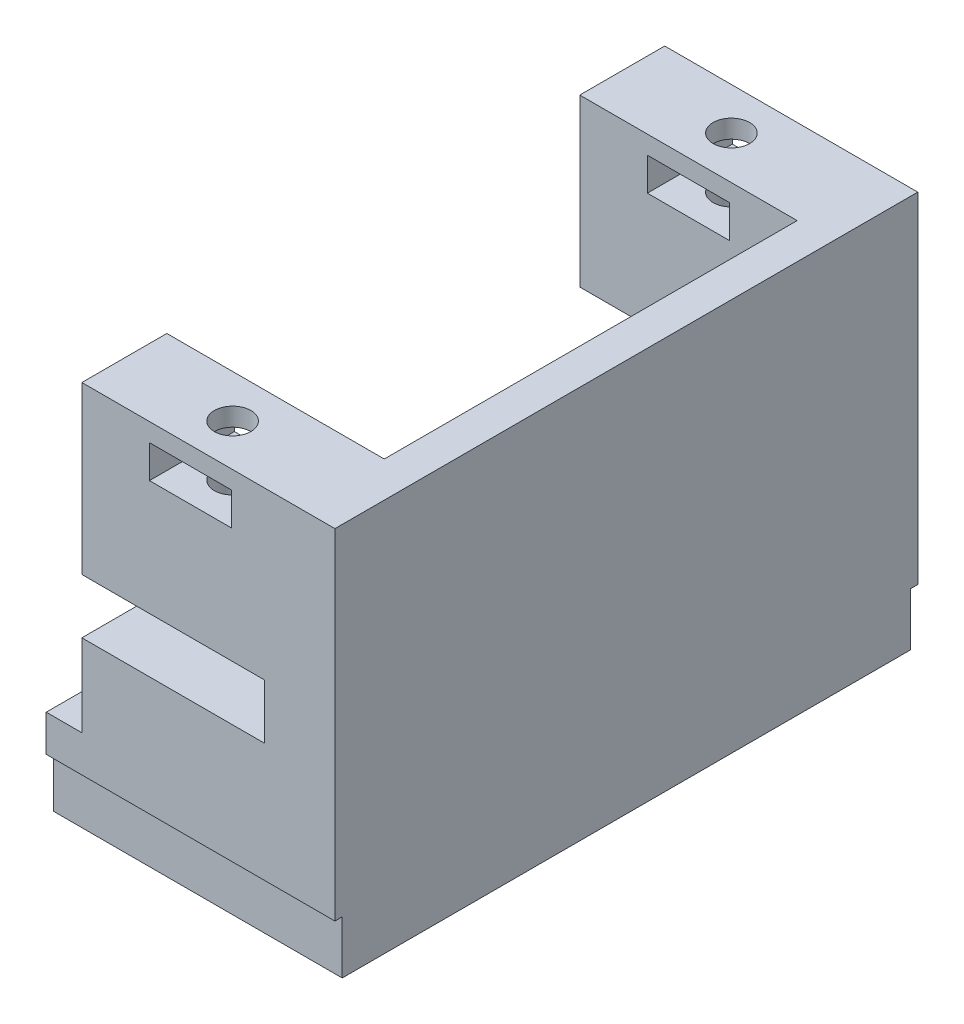
ISO-10303-21;
HEADER;
FILE_DESCRIPTION(('STEP AP214'),'2;1');
FILE_NAME('part.step','',(''),(''),'','','');
FILE_SCHEMA(('AUTOMOTIVE_DESIGN { 1 0 10303 214 1 1 1 1 }'));
ENDSEC;
DATA;
#1=APPLICATION_CONTEXT('core data for automotive mechanical design processes');
#2=APPLICATION_PROTOCOL_DEFINITION('international standard','automotive_design',2000,#1);
#3=PRODUCT_CONTEXT('',#1,'mechanical');
#4=PRODUCT('Part','Part','',(#3));
#5=PRODUCT_RELATED_PRODUCT_CATEGORY('part','',(#4));
#6=PRODUCT_DEFINITION_FORMATION('','',#4);
#7=PRODUCT_DEFINITION_CONTEXT('part definition',#1,'design');
#8=PRODUCT_DEFINITION('design','',#6,#7);
#9=PRODUCT_DEFINITION_SHAPE('','',#8);
#10=(LENGTH_UNIT() NAMED_UNIT(*) SI_UNIT(.MILLI.,.METRE.));
#11=(NAMED_UNIT(*) PLANE_ANGLE_UNIT() SI_UNIT($,.RADIAN.));
#12=(NAMED_UNIT(*) SI_UNIT($,.STERADIAN.) SOLID_ANGLE_UNIT());
#13=UNCERTAINTY_MEASURE_WITH_UNIT(LENGTH_MEASURE(1.E-05),#10,'distance_accuracy_value','');
#14=(GEOMETRIC_REPRESENTATION_CONTEXT(3) GLOBAL_UNCERTAINTY_ASSIGNED_CONTEXT((#13)) GLOBAL_UNIT_ASSIGNED_CONTEXT((#10,
#11,#12)) REPRESENTATION_CONTEXT('',''));
#15=CARTESIAN_POINT('',(0.,0.,0.));
#16=DIRECTION('',(0.,0.,1.));
#17=DIRECTION('',(1.,0.,0.));
#18=AXIS2_PLACEMENT_3D('',#15,#16,#17);
#19=CARTESIAN_POINT('',(-7.9,2.,-15.95));
#20=DIRECTION('',(0.,0.,1.));
#21=DIRECTION('',(1.,0.,0.));
#22=AXIS2_PLACEMENT_3D('',#19,#20,#21);
#23=PLANE('',#22);
#24=DIRECTION('',(0.,-1.,0.));
#25=VECTOR('',#24,1.);
#26=CARTESIAN_POINT('',(2.25000000000001,0.,-15.95));
#27=LINE('',#26,#25);
#28=CARTESIAN_POINT('',(2.25,17.6,-15.95));
#29=VERTEX_POINT('',#28);
#30=CARTESIAN_POINT('',(2.25,15.8,-15.95));
#31=VERTEX_POINT('',#30);
#32=EDGE_CURVE('E405',#29,#31,#27,.T.);
#33=ORIENTED_EDGE('',*,*,#32,.F.);
#34=DIRECTION('',(1.,0.,0.));
#35=VECTOR('',#34,1.);
#36=CARTESIAN_POINT('',(0.,17.6,-15.95));
#37=LINE('',#36,#35);
#38=CARTESIAN_POINT('',(-2.25,17.6,-15.95));
#39=VERTEX_POINT('',#38);
#40=EDGE_CURVE('E407',#39,#29,#37,.T.);
#41=ORIENTED_EDGE('',*,*,#40,.F.);
#42=DIRECTION('',(0.,-1.,0.));
#43=VECTOR('',#42,1.);
#44=CARTESIAN_POINT('',(-2.25,0.,-15.95));
#45=LINE('',#44,#43);
#46=CARTESIAN_POINT('',(-2.25,15.8,-15.95));
#47=VERTEX_POINT('',#46);
#48=EDGE_CURVE('E410',#39,#47,#45,.T.);
#49=ORIENTED_EDGE('',*,*,#48,.T.);
#50=DIRECTION('',(1.,0.,0.));
#51=VECTOR('',#50,1.);
#52=CARTESIAN_POINT('',(0.,15.8,-15.95));
#53=LINE('',#52,#51);
#54=EDGE_CURVE('E413',#47,#31,#53,.T.);
#55=ORIENTED_EDGE('',*,*,#54,.T.);
#56=EDGE_LOOP('',(#33,#41,#49,#55));
#57=FACE_BOUND('',#56,.T.);
#58=DIRECTION('',(-1.,0.,0.));
#59=VECTOR('',#58,1.);
#60=CARTESIAN_POINT('',(4.05,6.5,-15.95));
#61=LINE('',#60,#59);
#62=CARTESIAN_POINT('',(4.05,6.5,-15.95));
#63=VERTEX_POINT('',#62);
#64=CARTESIAN_POINT('',(-5.95,6.5,-15.95));
#65=VERTEX_POINT('',#64);
#66=EDGE_CURVE('E281',#63,#65,#61,.T.);
#67=ORIENTED_EDGE('',*,*,#66,.F.);
#68=DIRECTION('',(0.,1.,0.));
#69=VECTOR('',#68,1.);
#70=CARTESIAN_POINT('',(4.05,9.5,-15.95));
#71=LINE('',#70,#69);
#72=CARTESIAN_POINT('',(4.05,9.5,-15.95));
#73=VERTEX_POINT('',#72);
#74=EDGE_CURVE('E265',#63,#73,#71,.T.);
#75=ORIENTED_EDGE('',*,*,#74,.T.);
#76=DIRECTION('',(-1.,0.,0.));
#77=VECTOR('',#76,1.);
#78=CARTESIAN_POINT('',(4.05,9.5,-15.95));
#79=LINE('',#78,#77);
#80=CARTESIAN_POINT('',(-5.95,9.5,-15.95));
#81=VERTEX_POINT('',#80);
#82=EDGE_CURVE('E261',#73,#81,#79,.T.);
#83=ORIENTED_EDGE('',*,*,#82,.T.);
#84=DIRECTION('',(0.,1.,0.));
#85=VECTOR('',#84,1.);
#86=CARTESIAN_POINT('',(-5.95,-29.9595447401868,-15.95));
#87=LINE('',#86,#85);
#88=CARTESIAN_POINT('',(-5.95,18.6,-15.95));
#89=VERTEX_POINT('',#88);
#90=EDGE_CURVE('E398',#81,#89,#87,.T.);
#91=ORIENTED_EDGE('',*,*,#90,.T.);
#92=DIRECTION('',(-1.,0.,0.));
#93=VECTOR('',#92,1.);
#94=CARTESIAN_POINT('',(0.,18.6,-15.95));
#95=LINE('',#94,#93);
#96=CARTESIAN_POINT('',(7.9,18.6,-15.95));
#97=VERTEX_POINT('',#96);
#98=EDGE_CURVE('E478',#97,#89,#95,.T.);
#99=ORIENTED_EDGE('',*,*,#98,.F.);
#100=DIRECTION('',(0.,-1.,0.));
#101=VECTOR('',#100,1.);
#102=CARTESIAN_POINT('',(7.9,2.,-15.95));
#103=LINE('',#102,#101);
#104=CARTESIAN_POINT('',(7.9,0.,-15.95));
#105=VERTEX_POINT('',#104);
#106=EDGE_CURVE('E521',#97,#105,#103,.T.);
#107=ORIENTED_EDGE('',*,*,#106,.T.);
#108=DIRECTION('',(-1.,0.,0.));
#109=VECTOR('',#108,1.);
#110=CARTESIAN_POINT('',(-7.9,0.,-15.95));
#111=LINE('',#110,#109);
#112=CARTESIAN_POINT('',(-7.9,0.,-15.95));
#113=VERTEX_POINT('',#112);
#114=EDGE_CURVE('E510',#105,#113,#111,.T.);
#115=ORIENTED_EDGE('',*,*,#114,.T.);
#116=DIRECTION('',(0.,-1.,0.));
#117=VECTOR('',#116,1.);
#118=CARTESIAN_POINT('',(-7.9,2.,-15.95));
#119=LINE('',#118,#117);
#120=CARTESIAN_POINT('',(-7.9,2.,-15.95));
#121=VERTEX_POINT('',#120);
#122=EDGE_CURVE('E528',#121,#113,#119,.T.);
#123=ORIENTED_EDGE('',*,*,#122,.F.);
#124=DIRECTION('',(1.,0.,0.));
#125=VECTOR('',#124,1.);
#126=CARTESIAN_POINT('',(-7.9,2.,-15.95));
#127=LINE('',#126,#125);
#128=CARTESIAN_POINT('',(-5.95,2.,-15.95));
#129=VERTEX_POINT('',#128);
#130=EDGE_CURVE('E384',#121,#129,#127,.T.);
#131=ORIENTED_EDGE('',*,*,#130,.T.);
#132=EDGE_CURVE('E395',#129,#65,#87,.T.);
#133=ORIENTED_EDGE('',*,*,#132,.T.);
#134=EDGE_LOOP('',(#67,#75,#83,#91,#99,#107,#115,#123,#131,#133));
#135=FACE_BOUND('',#134,.T.);
#136=ADVANCED_FACE('F35',(#57,#135),#23,.F.);
#137=CARTESIAN_POINT('',(0.,18.6,-11.3));
#138=DIRECTION('',(0.,0.,-1.));
#139=DIRECTION('',(-1.,0.,0.));
#140=AXIS2_PLACEMENT_3D('',#137,#138,#139);
#141=PLANE('',#140);
#142=DIRECTION('',(0.,1.,0.));
#143=VECTOR('',#142,1.);
#144=CARTESIAN_POINT('',(2.25,18.6,-11.3));
#145=LINE('',#144,#143);
#146=CARTESIAN_POINT('',(2.25,15.8,-11.3));
#147=VERTEX_POINT('',#146);
#148=CARTESIAN_POINT('',(2.25,17.6,-11.3));
#149=VERTEX_POINT('',#148);
#150=EDGE_CURVE('E462',#147,#149,#145,.T.);
#151=ORIENTED_EDGE('',*,*,#150,.F.);
#152=DIRECTION('',(-1.,0.,0.));
#153=VECTOR('',#152,1.);
#154=CARTESIAN_POINT('',(0.,15.8,-11.3));
#155=LINE('',#154,#153);
#156=CARTESIAN_POINT('',(-2.25,15.8,-11.3));
#157=VERTEX_POINT('',#156);
#158=EDGE_CURVE('E456',#147,#157,#155,.T.);
#159=ORIENTED_EDGE('',*,*,#158,.T.);
#160=DIRECTION('',(0.,1.,0.));
#161=VECTOR('',#160,1.);
#162=CARTESIAN_POINT('',(-2.25,18.6,-11.3));
#163=LINE('',#162,#161);
#164=CARTESIAN_POINT('',(-2.25,17.6,-11.3));
#165=VERTEX_POINT('',#164);
#166=EDGE_CURVE('E459',#157,#165,#163,.T.);
#167=ORIENTED_EDGE('',*,*,#166,.T.);
#168=DIRECTION('',(-1.,0.,0.));
#169=VECTOR('',#168,1.);
#170=CARTESIAN_POINT('',(0.,17.6,-11.3));
#171=LINE('',#170,#169);
#172=EDGE_CURVE('E448',#149,#165,#171,.T.);
#173=ORIENTED_EDGE('',*,*,#172,.F.);
#174=EDGE_LOOP('',(#151,#159,#167,#173));
#175=FACE_BOUND('',#174,.T.);
#176=DIRECTION('',(-1.,0.,0.));
#177=VECTOR('',#176,1.);
#178=CARTESIAN_POINT('',(4.05,6.5,-11.3));
#179=LINE('',#178,#177);
#180=CARTESIAN_POINT('',(4.05,6.5,-11.3));
#181=VERTEX_POINT('',#180);
#182=CARTESIAN_POINT('',(-5.95,6.5,-11.3));
#183=VERTEX_POINT('',#182);
#184=EDGE_CURVE('E290',#181,#183,#179,.T.);
#185=ORIENTED_EDGE('',*,*,#184,.T.);
#186=DIRECTION('',(0.,-1.,0.));
#187=VECTOR('',#186,1.);
#188=CARTESIAN_POINT('',(-5.95,18.6,-11.3));
#189=LINE('',#188,#187);
#190=CARTESIAN_POINT('',(-5.95,2.,-11.3));
#191=VERTEX_POINT('',#190);
#192=EDGE_CURVE('E489',#183,#191,#189,.T.);
#193=ORIENTED_EDGE('',*,*,#192,.T.);
#194=DIRECTION('',(1.,0.,0.));
#195=VECTOR('',#194,1.);
#196=CARTESIAN_POINT('',(0.,2.,-11.3));
#197=LINE('',#196,#195);
#198=CARTESIAN_POINT('',(5.95,2.,-11.3));
#199=VERTEX_POINT('',#198);
#200=EDGE_CURVE('E471',#191,#199,#197,.T.);
#201=ORIENTED_EDGE('',*,*,#200,.T.);
#202=DIRECTION('',(0.,-1.,0.));
#203=VECTOR('',#202,1.);
#204=CARTESIAN_POINT('',(5.95,18.6,-11.3));
#205=LINE('',#204,#203);
#206=CARTESIAN_POINT('',(5.95,18.6,-11.3));
#207=VERTEX_POINT('',#206);
#208=EDGE_CURVE('E504',#207,#199,#205,.T.);
#209=ORIENTED_EDGE('',*,*,#208,.F.);
#210=DIRECTION('',(1.,0.,0.));
#211=VECTOR('',#210,1.);
#212=CARTESIAN_POINT('',(0.,18.6,-11.3));
#213=LINE('',#212,#211);
#214=CARTESIAN_POINT('',(-5.95,18.6,-11.3));
#215=VERTEX_POINT('',#214);
#216=EDGE_CURVE('E481',#215,#207,#213,.T.);
#217=ORIENTED_EDGE('',*,*,#216,.F.);
#218=CARTESIAN_POINT('',(-5.95,9.50000000000001,-11.3));
#219=VERTEX_POINT('',#218);
#220=EDGE_CURVE('E279',#215,#219,#189,.T.);
#221=ORIENTED_EDGE('',*,*,#220,.T.);
#222=DIRECTION('',(-1.,0.,0.));
#223=VECTOR('',#222,1.);
#224=CARTESIAN_POINT('',(4.05,9.5,-11.3));
#225=LINE('',#224,#223);
#226=CARTESIAN_POINT('',(4.05,9.5,-11.3));
#227=VERTEX_POINT('',#226);
#228=EDGE_CURVE('E53',#227,#219,#225,.T.);
#229=ORIENTED_EDGE('',*,*,#228,.F.);
#230=DIRECTION('',(0.,-1.,0.));
#231=VECTOR('',#230,1.);
#232=CARTESIAN_POINT('',(4.05,9.5,-11.3));
#233=LINE('',#232,#231);
#234=EDGE_CURVE('E266',#227,#181,#233,.T.);
#235=ORIENTED_EDGE('',*,*,#234,.T.);
#236=EDGE_LOOP('',(#185,#193,#201,#209,#217,#221,#229,#235));
#237=FACE_BOUND('',#236,.T.);
#238=ADVANCED_FACE('F277',(#175,#237),#141,.F.);
#239=CARTESIAN_POINT('',(0.,8.6,-13.65));
#240=DIRECTION('',(0.,1.,0.));
#241=DIRECTION('',(0.,0.,1.));
#242=AXIS2_PLACEMENT_3D('',#239,#240,#241);
#243=CYLINDRICAL_SURFACE('',#242,1.);
#244=CARTESIAN_POINT('',(0.,15.8,-13.65));
#245=DIRECTION('',(0.,-1.,0.));
#246=DIRECTION('',(0.,0.,-1.));
#247=AXIS2_PLACEMENT_3D('',#244,#245,#246);
#248=CIRCLE('',#247,1.);
#249=CARTESIAN_POINT('',(0.,15.8,-14.65));
#250=VERTEX_POINT('',#249);
#251=EDGE_CURVE('E451',#250,#250,#248,.F.);
#252=ORIENTED_EDGE('',*,*,#251,.T.);
#253=EDGE_LOOP('',(#252));
#254=FACE_BOUND('',#253,.T.);
#255=CARTESIAN_POINT('',(0.,9.5,-13.65));
#256=DIRECTION('',(0.,-1.,0.));
#257=DIRECTION('',(0.,0.,-1.));
#258=AXIS2_PLACEMENT_3D('',#255,#256,#257);
#259=CIRCLE('',#258,1.);
#260=CARTESIAN_POINT('',(0.,9.5,-14.65));
#261=VERTEX_POINT('',#260);
#262=EDGE_CURVE('E286',#261,#261,#259,.F.);
#263=ORIENTED_EDGE('',*,*,#262,.F.);
#264=EDGE_LOOP('',(#263));
#265=FACE_BOUND('',#264,.T.);
#266=ADVANCED_FACE('F591',(#254,#265),#243,.F.);
#267=CARTESIAN_POINT('',(-5.95,-29.9595447401868,-15.95));
#268=DIRECTION('',(1.,0.,0.));
#269=DIRECTION('',(0.,0.,-1.));
#270=AXIS2_PLACEMENT_3D('',#267,#268,#269);
#271=PLANE('',#270);
#272=DIRECTION('',(0.,0.,-1.));
#273=VECTOR('',#272,1.);
#274=CARTESIAN_POINT('',(-5.95,6.5,-11.3));
#275=LINE('',#274,#273);
#276=EDGE_CURVE('E274',#183,#65,#275,.T.);
#277=ORIENTED_EDGE('',*,*,#276,.T.);
#278=ORIENTED_EDGE('',*,*,#132,.F.);
#279=DIRECTION('',(0.,0.,1.));
#280=VECTOR('',#279,1.);
#281=CARTESIAN_POINT('',(-5.95,2.,-15.95));
#282=LINE('',#281,#280);
#283=EDGE_CURVE('E381',#129,#191,#282,.T.);
#284=ORIENTED_EDGE('',*,*,#283,.T.);
#285=ORIENTED_EDGE('',*,*,#192,.F.);
#286=EDGE_LOOP('',(#277,#278,#284,#285));
#287=FACE_BOUND('',#286,.T.);
#288=ADVANCED_FACE('F627',(#287),#271,.F.);
#289=DIRECTION('',(0.,0.,1.));
#290=VECTOR('',#289,1.);
#291=CARTESIAN_POINT('',(-5.95,9.5,-11.3));
#292=LINE('',#291,#290);
#293=EDGE_CURVE('E706',#81,#219,#292,.T.);
#294=ORIENTED_EDGE('',*,*,#293,.T.);
#295=ORIENTED_EDGE('',*,*,#220,.F.);
#296=DIRECTION('',(0.,0.,-1.));
#297=VECTOR('',#296,1.);
#298=CARTESIAN_POINT('',(-5.95,18.6,-15.95));
#299=LINE('',#298,#297);
#300=EDGE_CURVE('E380',#215,#89,#299,.T.);
#301=ORIENTED_EDGE('',*,*,#300,.T.);
#302=ORIENTED_EDGE('',*,*,#90,.F.);
#303=EDGE_LOOP('',(#294,#295,#301,#302));
#304=FACE_BOUND('',#303,.T.);
#305=ADVANCED_FACE('F715',(#304),#271,.F.);
#306=CARTESIAN_POINT('',(0.,0.,0.));
#307=DIRECTION('',(0.,1.,0.));
#308=DIRECTION('',(0.,0.,1.));
#309=AXIS2_PLACEMENT_3D('',#306,#307,#308);
#310=PLANE('',#309);
#311=DIRECTION('',(1.,0.,0.));
#312=VECTOR('',#311,1.);
#313=CARTESIAN_POINT('',(0.,0.,-15.55));
#314=LINE('',#313,#312);
#315=CARTESIAN_POINT('',(-7.9,0.,-15.55));
#316=VERTEX_POINT('',#315);
#317=CARTESIAN_POINT('',(7.9,0.,-15.55));
#318=VERTEX_POINT('',#317);
#319=EDGE_CURVE('E321',#316,#318,#314,.T.);
#320=ORIENTED_EDGE('',*,*,#319,.F.);
#321=DIRECTION('',(0.,0.,1.));
#322=VECTOR('',#321,1.);
#323=CARTESIAN_POINT('',(-7.9,0.,-15.95));
#324=LINE('',#323,#322);
#325=EDGE_CURVE('E537',#113,#316,#324,.T.);
#326=ORIENTED_EDGE('',*,*,#325,.F.);
#327=ORIENTED_EDGE('',*,*,#114,.F.);
#328=DIRECTION('',(0.,0.,-1.));
#329=VECTOR('',#328,1.);
#330=CARTESIAN_POINT('',(7.9,0.,-15.95));
#331=LINE('',#330,#329);
#332=EDGE_CURVE('E507',#318,#105,#331,.T.);
#333=ORIENTED_EDGE('',*,*,#332,.F.);
#334=EDGE_LOOP('',(#320,#326,#327,#333));
#335=FACE_BOUND('',#334,.T.);
#336=ADVANCED_FACE('F559',(#335),#310,.F.);
#337=CARTESIAN_POINT('',(-7.9,0.,15.55));
#338=VERTEX_POINT('',#337);
#339=CARTESIAN_POINT('',(-7.9,0.,15.95));
#340=VERTEX_POINT('',#339);
#341=EDGE_CURVE('E542',#338,#340,#324,.T.);
#342=ORIENTED_EDGE('',*,*,#341,.F.);
#343=DIRECTION('',(1.,0.,0.));
#344=VECTOR('',#343,1.);
#345=CARTESIAN_POINT('',(0.,0.,15.55));
#346=LINE('',#345,#344);
#347=CARTESIAN_POINT('',(7.9,0.,15.55));
#348=VERTEX_POINT('',#347);
#349=EDGE_CURVE('E295',#338,#348,#346,.T.);
#350=ORIENTED_EDGE('',*,*,#349,.T.);
#351=CARTESIAN_POINT('',(7.9,0.,15.95));
#352=VERTEX_POINT('',#351);
#353=EDGE_CURVE('E516',#352,#348,#331,.T.);
#354=ORIENTED_EDGE('',*,*,#353,.F.);
#355=DIRECTION('',(1.,0.,0.));
#356=VECTOR('',#355,1.);
#357=CARTESIAN_POINT('',(-7.9,0.,15.95));
#358=LINE('',#357,#356);
#359=EDGE_CURVE('E536',#340,#352,#358,.T.);
#360=ORIENTED_EDGE('',*,*,#359,.F.);
#361=EDGE_LOOP('',(#342,#350,#354,#360));
#362=FACE_BOUND('',#361,.T.);
#363=ADVANCED_FACE('F608',(#362),#310,.F.);
#364=DIRECTION('',(0.,-1.,0.));
#365=VECTOR('',#364,1.);
#366=CARTESIAN_POINT('',(-5.95,18.6,11.3));
#367=LINE('',#366,#365);
#368=CARTESIAN_POINT('',(-5.95,18.6,11.3));
#369=VERTEX_POINT('',#368);
#370=CARTESIAN_POINT('',(-5.95,9.5,11.3));
#371=VERTEX_POINT('',#370);
#372=EDGE_CURVE('E498',#369,#371,#367,.T.);
#373=ORIENTED_EDGE('',*,*,#372,.T.);
#374=DIRECTION('',(0.,0.,-1.));
#375=VECTOR('',#374,1.);
#376=CARTESIAN_POINT('',(-5.95,9.5,11.3));
#377=LINE('',#376,#375);
#378=CARTESIAN_POINT('',(-5.95,9.5,15.95));
#379=VERTEX_POINT('',#378);
#380=EDGE_CURVE('E356',#379,#371,#377,.T.);
#381=ORIENTED_EDGE('',*,*,#380,.F.);
#382=DIRECTION('',(0.,1.,0.));
#383=VECTOR('',#382,1.);
#384=CARTESIAN_POINT('',(-5.95,-29.9595447401868,15.95));
#385=LINE('',#384,#383);
#386=CARTESIAN_POINT('',(-5.95,18.6,15.95));
#387=VERTEX_POINT('',#386);
#388=EDGE_CURVE('E394',#379,#387,#385,.T.);
#389=ORIENTED_EDGE('',*,*,#388,.T.);
#390=EDGE_CURVE('E392',#387,#369,#299,.T.);
#391=ORIENTED_EDGE('',*,*,#390,.T.);
#392=EDGE_LOOP('',(#373,#381,#389,#391));
#393=FACE_BOUND('',#392,.T.);
#394=ADVANCED_FACE('F599',(#393),#271,.F.);
#395=CARTESIAN_POINT('',(-7.9,2.,-15.95));
#396=DIRECTION('',(1.,0.,0.));
#397=DIRECTION('',(0.,0.,-1.));
#398=AXIS2_PLACEMENT_3D('',#395,#396,#397);
#399=PLANE('',#398);
#400=DIRECTION('',(0.,0.,-1.));
#401=VECTOR('',#400,1.);
#402=CARTESIAN_POINT('',(-7.9,2.,-15.95));
#403=LINE('',#402,#401);
#404=CARTESIAN_POINT('',(-7.9,2.,15.95));
#405=VERTEX_POINT('',#404);
#406=EDGE_CURVE('E388',#405,#121,#403,.T.);
#407=ORIENTED_EDGE('',*,*,#406,.T.);
#408=ORIENTED_EDGE('',*,*,#122,.T.);
#409=ORIENTED_EDGE('',*,*,#325,.T.);
#410=DIRECTION('',(0.,1.,0.));
#411=VECTOR('',#410,1.);
#412=CARTESIAN_POINT('',(-7.9,-2.9,-15.55));
#413=LINE('',#412,#411);
#414=CARTESIAN_POINT('',(-7.9,-2.9,-15.55));
#415=VERTEX_POINT('',#414);
#416=EDGE_CURVE('E330',#415,#316,#413,.T.);
#417=ORIENTED_EDGE('',*,*,#416,.F.);
#418=DIRECTION('',(0.,0.,-1.));
#419=VECTOR('',#418,1.);
#420=CARTESIAN_POINT('',(-7.9,-2.9,0.));
#421=LINE('',#420,#419);
#422=CARTESIAN_POINT('',(-7.9,-2.9,-12.55));
#423=VERTEX_POINT('',#422);
#424=EDGE_CURVE('E302',#423,#415,#421,.T.);
#425=ORIENTED_EDGE('',*,*,#424,.F.);
#426=DIRECTION('',(0.,1.,0.));
#427=VECTOR('',#426,1.);
#428=CARTESIAN_POINT('',(-7.9,-2.9,-12.55));
#429=LINE('',#428,#427);
#430=CARTESIAN_POINT('',(-7.9,0.,-12.55));
#431=VERTEX_POINT('',#430);
#432=EDGE_CURVE('E336',#423,#431,#429,.T.);
#433=ORIENTED_EDGE('',*,*,#432,.T.);
#434=CARTESIAN_POINT('',(-7.9,0.,12.55));
#435=VERTEX_POINT('',#434);
#436=EDGE_CURVE('E546',#431,#435,#324,.T.);
#437=ORIENTED_EDGE('',*,*,#436,.T.);
#438=DIRECTION('',(0.,1.,0.));
#439=VECTOR('',#438,1.);
#440=CARTESIAN_POINT('',(-7.9,-2.9,12.55));
#441=LINE('',#440,#439);
#442=CARTESIAN_POINT('',(-7.9,-2.9,12.55));
#443=VERTEX_POINT('',#442);
#444=EDGE_CURVE('E349',#443,#435,#441,.T.);
#445=ORIENTED_EDGE('',*,*,#444,.F.);
#446=DIRECTION('',(0.,0.,-1.));
#447=VECTOR('',#446,1.);
#448=CARTESIAN_POINT('',(-7.9,-2.9,0.));
#449=LINE('',#448,#447);
#450=CARTESIAN_POINT('',(-7.9,-2.9,15.55));
#451=VERTEX_POINT('',#450);
#452=EDGE_CURVE('E291',#451,#443,#449,.T.);
#453=ORIENTED_EDGE('',*,*,#452,.F.);
#454=DIRECTION('',(0.,1.,0.));
#455=VECTOR('',#454,1.);
#456=CARTESIAN_POINT('',(-7.9,-2.9,15.55));
#457=LINE('',#456,#455);
#458=EDGE_CURVE('E311',#451,#338,#457,.T.);
#459=ORIENTED_EDGE('',*,*,#458,.T.);
#460=ORIENTED_EDGE('',*,*,#341,.T.);
#461=DIRECTION('',(0.,-1.,0.));
#462=VECTOR('',#461,1.);
#463=CARTESIAN_POINT('',(-7.9,2.,15.95));
#464=LINE('',#463,#462);
#465=EDGE_CURVE('E530',#405,#340,#464,.T.);
#466=ORIENTED_EDGE('',*,*,#465,.F.);
#467=EDGE_LOOP('',(#407,#408,#409,#417,#425,#433,#437,#445,#453,#459,#460,#466));
#468=FACE_BOUND('',#467,.T.);
#469=ADVANCED_FACE('F561',(#468),#399,.F.);
#470=CARTESIAN_POINT('',(-7.9,2.,15.95));
#471=DIRECTION('',(0.,0.,-1.));
#472=DIRECTION('',(-1.,0.,0.));
#473=AXIS2_PLACEMENT_3D('',#470,#471,#472);
#474=PLANE('',#473);
#475=ORIENTED_EDGE('',*,*,#388,.F.);
#476=DIRECTION('',(-1.,0.,0.));
#477=VECTOR('',#476,1.);
#478=CARTESIAN_POINT('',(4.05,9.5,15.95));
#479=LINE('',#478,#477);
#480=CARTESIAN_POINT('',(4.05,9.5,15.95));
#481=VERTEX_POINT('',#480);
#482=EDGE_CURVE('E372',#481,#379,#479,.T.);
#483=ORIENTED_EDGE('',*,*,#482,.F.);
#484=DIRECTION('',(0.,1.,0.));
#485=VECTOR('',#484,1.);
#486=CARTESIAN_POINT('',(4.05,9.5,15.95));
#487=LINE('',#486,#485);
#488=CARTESIAN_POINT('',(4.05,6.5,15.95));
#489=VERTEX_POINT('',#488);
#490=EDGE_CURVE('E359',#489,#481,#487,.T.);
#491=ORIENTED_EDGE('',*,*,#490,.F.);
#492=DIRECTION('',(-1.,0.,0.));
#493=VECTOR('',#492,1.);
#494=CARTESIAN_POINT('',(4.05,6.5,15.95));
#495=LINE('',#494,#493);
#496=CARTESIAN_POINT('',(-5.95,6.5,15.95));
#497=VERTEX_POINT('',#496);
#498=EDGE_CURVE('E374',#489,#497,#495,.T.);
#499=ORIENTED_EDGE('',*,*,#498,.T.);
#500=CARTESIAN_POINT('',(-5.95,1.99999999999999,15.95));
#501=VERTEX_POINT('',#500);
#502=EDGE_CURVE('E399',#501,#497,#385,.T.);
#503=ORIENTED_EDGE('',*,*,#502,.F.);
#504=DIRECTION('',(-1.,0.,0.));
#505=VECTOR('',#504,1.);
#506=CARTESIAN_POINT('',(-7.9,2.,15.95));
#507=LINE('',#506,#505);
#508=EDGE_CURVE('E391',#501,#405,#507,.T.);
#509=ORIENTED_EDGE('',*,*,#508,.T.);
#510=ORIENTED_EDGE('',*,*,#465,.T.);
#511=ORIENTED_EDGE('',*,*,#359,.T.);
#512=DIRECTION('',(0.,-1.,0.));
#513=VECTOR('',#512,1.);
#514=CARTESIAN_POINT('',(7.9,2.,15.95));
#515=LINE('',#514,#513);
#516=CARTESIAN_POINT('',(7.9,18.6,15.95));
#517=VERTEX_POINT('',#516);
#518=EDGE_CURVE('E533',#517,#352,#515,.T.);
#519=ORIENTED_EDGE('',*,*,#518,.F.);
#520=DIRECTION('',(1.,0.,0.));
#521=VECTOR('',#520,1.);
#522=CARTESIAN_POINT('',(0.,18.6,15.95));
#523=LINE('',#522,#521);
#524=EDGE_CURVE('E472',#387,#517,#523,.T.);
#525=ORIENTED_EDGE('',*,*,#524,.F.);
#526=EDGE_LOOP('',(#475,#483,#491,#499,#503,#509,#510,#511,#519,#525));
#527=FACE_BOUND('',#526,.T.);
#528=DIRECTION('',(0.,-1.,0.));
#529=VECTOR('',#528,1.);
#530=CARTESIAN_POINT('',(2.25000000000001,0.,15.95));
#531=LINE('',#530,#529);
#532=CARTESIAN_POINT('',(2.25,17.6,15.95));
#533=VERTEX_POINT('',#532);
#534=CARTESIAN_POINT('',(2.25,15.8,15.95));
#535=VERTEX_POINT('',#534);
#536=EDGE_CURVE('E404',#533,#535,#531,.T.);
#537=ORIENTED_EDGE('',*,*,#536,.T.);
#538=DIRECTION('',(1.,0.,0.));
#539=VECTOR('',#538,1.);
#540=CARTESIAN_POINT('',(0.,15.8,15.95));
#541=LINE('',#540,#539);
#542=CARTESIAN_POINT('',(-2.25,15.8,15.95));
#543=VERTEX_POINT('',#542);
#544=EDGE_CURVE('E408',#543,#535,#541,.T.);
#545=ORIENTED_EDGE('',*,*,#544,.F.);
#546=DIRECTION('',(0.,-1.,0.));
#547=VECTOR('',#546,1.);
#548=CARTESIAN_POINT('',(-2.25,0.,15.95));
#549=LINE('',#548,#547);
#550=CARTESIAN_POINT('',(-2.25,17.6,15.95));
#551=VERTEX_POINT('',#550);
#552=EDGE_CURVE('E422',#551,#543,#549,.T.);
#553=ORIENTED_EDGE('',*,*,#552,.F.);
#554=DIRECTION('',(1.,0.,0.));
#555=VECTOR('',#554,1.);
#556=CARTESIAN_POINT('',(0.,17.6,15.95));
#557=LINE('',#556,#555);
#558=EDGE_CURVE('E419',#551,#533,#557,.T.);
#559=ORIENTED_EDGE('',*,*,#558,.T.);
#560=EDGE_LOOP('',(#537,#545,#553,#559));
#561=FACE_BOUND('',#560,.T.);
#562=ADVANCED_FACE('F598',(#527,#561),#474,.F.);
#563=CARTESIAN_POINT('',(0.,18.6,11.3));
#564=DIRECTION('',(0.,0.,-1.));
#565=DIRECTION('',(-1.,0.,0.));
#566=AXIS2_PLACEMENT_3D('',#563,#564,#565);
#567=PLANE('',#566);
#568=DIRECTION('',(-1.,0.,0.));
#569=VECTOR('',#568,1.);
#570=CARTESIAN_POINT('',(4.05,9.5,11.3));
#571=LINE('',#570,#569);
#572=CARTESIAN_POINT('',(4.05,9.5,11.3));
#573=VERTEX_POINT('',#572);
#574=EDGE_CURVE('E368',#573,#371,#571,.T.);
#575=ORIENTED_EDGE('',*,*,#574,.T.);
#576=ORIENTED_EDGE('',*,*,#372,.F.);
#577=DIRECTION('',(1.,0.,0.));
#578=VECTOR('',#577,1.);
#579=CARTESIAN_POINT('',(0.,18.6,11.3));
#580=LINE('',#579,#578);
#581=CARTESIAN_POINT('',(5.95,18.6,11.3));
#582=VERTEX_POINT('',#581);
#583=EDGE_CURVE('E486',#369,#582,#580,.T.);
#584=ORIENTED_EDGE('',*,*,#583,.T.);
#585=DIRECTION('',(0.,-1.,0.));
#586=VECTOR('',#585,1.);
#587=CARTESIAN_POINT('',(5.95,18.6,11.3));
#588=LINE('',#587,#586);
#589=CARTESIAN_POINT('',(5.95,2.,11.3));
#590=VERTEX_POINT('',#589);
#591=EDGE_CURVE('E501',#582,#590,#588,.T.);
#592=ORIENTED_EDGE('',*,*,#591,.T.);
#593=DIRECTION('',(1.,0.,0.));
#594=VECTOR('',#593,1.);
#595=CARTESIAN_POINT('',(0.,2.,11.3));
#596=LINE('',#595,#594);
#597=CARTESIAN_POINT('',(-5.95,2.,11.3));
#598=VERTEX_POINT('',#597);
#599=EDGE_CURVE('E475',#598,#590,#596,.T.);
#600=ORIENTED_EDGE('',*,*,#599,.F.);
#601=CARTESIAN_POINT('',(-5.95,6.5,11.3));
#602=VERTEX_POINT('',#601);
#603=EDGE_CURVE('E497',#602,#598,#367,.T.);
#604=ORIENTED_EDGE('',*,*,#603,.F.);
#605=DIRECTION('',(-1.,0.,0.));
#606=VECTOR('',#605,1.);
#607=CARTESIAN_POINT('',(4.05,6.5,11.3));
#608=LINE('',#607,#606);
#609=CARTESIAN_POINT('',(4.05,6.5,11.3));
#610=VERTEX_POINT('',#609);
#611=EDGE_CURVE('E364',#610,#602,#608,.T.);
#612=ORIENTED_EDGE('',*,*,#611,.F.);
#613=DIRECTION('',(0.,-1.,0.));
#614=VECTOR('',#613,1.);
#615=CARTESIAN_POINT('',(4.05,9.5,11.3));
#616=LINE('',#615,#614);
#617=EDGE_CURVE('E352',#573,#610,#616,.T.);
#618=ORIENTED_EDGE('',*,*,#617,.F.);
#619=EDGE_LOOP('',(#575,#576,#584,#592,#600,#604,#612,#618));
#620=FACE_BOUND('',#619,.T.);
#621=DIRECTION('',(-1.,0.,0.));
#622=VECTOR('',#621,1.);
#623=CARTESIAN_POINT('',(0.,15.8,11.3));
#624=LINE('',#623,#622);
#625=CARTESIAN_POINT('',(2.25,15.8,11.3));
#626=VERTEX_POINT('',#625);
#627=CARTESIAN_POINT('',(-2.25,15.8,11.3));
#628=VERTEX_POINT('',#627);
#629=EDGE_CURVE('E454',#626,#628,#624,.T.);
#630=ORIENTED_EDGE('',*,*,#629,.F.);
#631=DIRECTION('',(0.,1.,0.));
#632=VECTOR('',#631,1.);
#633=CARTESIAN_POINT('',(2.25,18.6,11.3));
#634=LINE('',#633,#632);
#635=CARTESIAN_POINT('',(2.25,17.6,11.3));
#636=VERTEX_POINT('',#635);
#637=EDGE_CURVE('E11',#626,#636,#634,.T.);
#638=ORIENTED_EDGE('',*,*,#637,.T.);
#639=DIRECTION('',(-1.,0.,0.));
#640=VECTOR('',#639,1.);
#641=CARTESIAN_POINT('',(0.,17.6,11.3));
#642=LINE('',#641,#640);
#643=CARTESIAN_POINT('',(-2.25,17.6,11.3));
#644=VERTEX_POINT('',#643);
#645=EDGE_CURVE('E445',#636,#644,#642,.T.);
#646=ORIENTED_EDGE('',*,*,#645,.T.);
#647=DIRECTION('',(0.,1.,0.));
#648=VECTOR('',#647,1.);
#649=CARTESIAN_POINT('',(-2.25,18.6,11.3));
#650=LINE('',#649,#648);
#651=EDGE_CURVE('E45',#628,#644,#650,.T.);
#652=ORIENTED_EDGE('',*,*,#651,.F.);
#653=EDGE_LOOP('',(#630,#638,#646,#652));
#654=FACE_BOUND('',#653,.T.);
#655=ADVANCED_FACE('F602',(#620,#654),#567,.T.);
#656=CARTESIAN_POINT('',(0.,18.6,-13.65));
#657=DIRECTION('',(0.,1.,0.));
#658=DIRECTION('',(0.,0.,1.));
#659=AXIS2_PLACEMENT_3D('',#656,#657,#658);
#660=CIRCLE('',#659,1.);
#661=CARTESIAN_POINT('',(0.,18.6,-12.65));
#662=VERTEX_POINT('',#661);
#663=EDGE_CURVE('E468',#662,#662,#660,.T.);
#664=ORIENTED_EDGE('',*,*,#663,.T.);
#665=EDGE_LOOP('',(#664));
#666=FACE_BOUND('',#665,.T.);
#667=CARTESIAN_POINT('',(0.,17.6,-13.65));
#668=DIRECTION('',(0.,-1.,0.));
#669=DIRECTION('',(0.,0.,-1.));
#670=AXIS2_PLACEMENT_3D('',#667,#668,#669);
#671=CIRCLE('',#670,1.);
#672=CARTESIAN_POINT('',(0.,17.6,-14.65));
#673=VERTEX_POINT('',#672);
#674=EDGE_CURVE('E442',#673,#673,#671,.F.);
#675=ORIENTED_EDGE('',*,*,#674,.F.);
#676=EDGE_LOOP('',(#675));
#677=FACE_BOUND('',#676,.T.);
#678=ADVANCED_FACE('F620',(#666,#677),#243,.F.);
#679=CARTESIAN_POINT('',(0.,8.6,13.65));
#680=DIRECTION('',(0.,1.,0.));
#681=DIRECTION('',(0.,0.,1.));
#682=AXIS2_PLACEMENT_3D('',#679,#680,#681);
#683=CYLINDRICAL_SURFACE('',#682,1.);
#684=CARTESIAN_POINT('',(0.,18.6,13.65));
#685=DIRECTION('',(0.,1.,0.));
#686=DIRECTION('',(0.,0.,-1.));
#687=AXIS2_PLACEMENT_3D('',#684,#685,#686);
#688=CIRCLE('',#687,1.);
#689=CARTESIAN_POINT('',(0.,18.6,12.65));
#690=VERTEX_POINT('',#689);
#691=EDGE_CURVE('E465',#690,#690,#688,.T.);
#692=ORIENTED_EDGE('',*,*,#691,.T.);
#693=EDGE_LOOP('',(#692));
#694=FACE_BOUND('',#693,.T.);
#695=CARTESIAN_POINT('',(0.,17.6,13.65));
#696=DIRECTION('',(0.,-1.,0.));
#697=DIRECTION('',(0.,0.,-1.));
#698=AXIS2_PLACEMENT_3D('',#695,#696,#697);
#699=CIRCLE('',#698,1.);
#700=CARTESIAN_POINT('',(0.,17.6,12.65));
#701=VERTEX_POINT('',#700);
#702=EDGE_CURVE('E430',#701,#701,#699,.F.);
#703=ORIENTED_EDGE('',*,*,#702,.F.);
#704=EDGE_LOOP('',(#703));
#705=FACE_BOUND('',#704,.T.);
#706=ADVANCED_FACE('F635',(#694,#705),#683,.F.);
#707=CARTESIAN_POINT('',(7.9,2.,-15.95));
#708=DIRECTION('',(-1.,0.,0.));
#709=DIRECTION('',(0.,0.,1.));
#710=AXIS2_PLACEMENT_3D('',#707,#708,#709);
#711=PLANE('',#710);
#712=ORIENTED_EDGE('',*,*,#353,.T.);
#713=DIRECTION('',(0.,1.,0.));
#714=VECTOR('',#713,1.);
#715=CARTESIAN_POINT('',(7.9,-2.9,15.55));
#716=LINE('',#715,#714);
#717=CARTESIAN_POINT('',(7.9,-2.9,15.55));
#718=VERTEX_POINT('',#717);
#719=EDGE_CURVE('E331',#718,#348,#716,.T.);
#720=ORIENTED_EDGE('',*,*,#719,.F.);
#721=DIRECTION('',(0.,0.,1.));
#722=VECTOR('',#721,1.);
#723=CARTESIAN_POINT('',(7.9,-2.9,0.));
#724=LINE('',#723,#722);
#725=CARTESIAN_POINT('',(7.9,-2.9,-15.55));
#726=VERTEX_POINT('',#725);
#727=EDGE_CURVE('E306',#726,#718,#724,.T.);
#728=ORIENTED_EDGE('',*,*,#727,.F.);
#729=DIRECTION('',(0.,1.,0.));
#730=VECTOR('',#729,1.);
#731=CARTESIAN_POINT('',(7.9,-2.9,-15.55));
#732=LINE('',#731,#730);
#733=EDGE_CURVE('E327',#726,#318,#732,.T.);
#734=ORIENTED_EDGE('',*,*,#733,.T.);
#735=ORIENTED_EDGE('',*,*,#332,.T.);
#736=ORIENTED_EDGE('',*,*,#106,.F.);
#737=DIRECTION('',(0.,0.,-1.));
#738=VECTOR('',#737,1.);
#739=CARTESIAN_POINT('',(7.9,18.6,0.));
#740=LINE('',#739,#738);
#741=EDGE_CURVE('E474',#517,#97,#740,.T.);
#742=ORIENTED_EDGE('',*,*,#741,.F.);
#743=ORIENTED_EDGE('',*,*,#518,.T.);
#744=EDGE_LOOP('',(#712,#720,#728,#734,#735,#736,#742,#743));
#745=FACE_BOUND('',#744,.T.);
#746=ADVANCED_FACE('F37',(#745),#711,.F.);
#747=ORIENTED_EDGE('',*,*,#436,.F.);
#748=DIRECTION('',(1.,0.,0.));
#749=VECTOR('',#748,1.);
#750=CARTESIAN_POINT('',(0.,0.,-12.55));
#751=LINE('',#750,#749);
#752=CARTESIAN_POINT('',(5.90000000000001,0.,-12.55));
#753=VERTEX_POINT('',#752);
#754=EDGE_CURVE('E39',#431,#753,#751,.T.);
#755=ORIENTED_EDGE('',*,*,#754,.T.);
#756=DIRECTION('',(0.,0.,-1.));
#757=VECTOR('',#756,1.);
#758=CARTESIAN_POINT('',(5.90000000000001,0.,0.));
#759=LINE('',#758,#757);
#760=CARTESIAN_POINT('',(5.90000000000001,0.,12.55));
#761=VERTEX_POINT('',#760);
#762=EDGE_CURVE('E312',#761,#753,#759,.T.);
#763=ORIENTED_EDGE('',*,*,#762,.F.);
#764=DIRECTION('',(1.,0.,0.));
#765=VECTOR('',#764,1.);
#766=CARTESIAN_POINT('',(0.,0.,12.55));
#767=LINE('',#766,#765);
#768=EDGE_CURVE('E289',#435,#761,#767,.T.);
#769=ORIENTED_EDGE('',*,*,#768,.F.);
#770=EDGE_LOOP('',(#747,#755,#763,#769));
#771=FACE_BOUND('',#770,.T.);
#772=ADVANCED_FACE('F604',(#771),#310,.F.);
#773=CARTESIAN_POINT('',(5.95,18.6,0.));
#774=DIRECTION('',(1.,0.,0.));
#775=DIRECTION('',(0.,0.,-1.));
#776=AXIS2_PLACEMENT_3D('',#773,#774,#775);
#777=PLANE('',#776);
#778=DIRECTION('',(0.,0.,1.));
#779=VECTOR('',#778,1.);
#780=CARTESIAN_POINT('',(5.95,2.,0.));
#781=LINE('',#780,#779);
#782=EDGE_CURVE('E492',#199,#590,#781,.T.);
#783=ORIENTED_EDGE('',*,*,#782,.T.);
#784=ORIENTED_EDGE('',*,*,#591,.F.);
#785=DIRECTION('',(0.,0.,1.));
#786=VECTOR('',#785,1.);
#787=CARTESIAN_POINT('',(5.95,18.6,0.));
#788=LINE('',#787,#786);
#789=EDGE_CURVE('E484',#207,#582,#788,.T.);
#790=ORIENTED_EDGE('',*,*,#789,.F.);
#791=ORIENTED_EDGE('',*,*,#208,.T.);
#792=EDGE_LOOP('',(#783,#784,#790,#791));
#793=FACE_BOUND('',#792,.T.);
#794=ADVANCED_FACE('F607',(#793),#777,.F.);
#795=CARTESIAN_POINT('',(0.,18.6,0.));
#796=DIRECTION('',(0.,1.,0.));
#797=DIRECTION('',(0.,0.,1.));
#798=AXIS2_PLACEMENT_3D('',#795,#796,#797);
#799=PLANE('',#798);
#800=ORIENTED_EDGE('',*,*,#390,.F.);
#801=ORIENTED_EDGE('',*,*,#524,.T.);
#802=ORIENTED_EDGE('',*,*,#741,.T.);
#803=ORIENTED_EDGE('',*,*,#98,.T.);
#804=ORIENTED_EDGE('',*,*,#300,.F.);
#805=ORIENTED_EDGE('',*,*,#216,.T.);
#806=ORIENTED_EDGE('',*,*,#789,.T.);
#807=ORIENTED_EDGE('',*,*,#583,.F.);
#808=EDGE_LOOP('',(#800,#801,#802,#803,#804,#805,#806,#807));
#809=FACE_BOUND('',#808,.T.);
#810=ORIENTED_EDGE('',*,*,#691,.F.);
#811=EDGE_LOOP('',(#810));
#812=FACE_BOUND('',#811,.T.);
#813=ORIENTED_EDGE('',*,*,#663,.F.);
#814=EDGE_LOOP('',(#813));
#815=FACE_BOUND('',#814,.T.);
#816=ADVANCED_FACE('F612',(#809,#812,#815),#799,.T.);
#817=CARTESIAN_POINT('',(0.,2.,0.));
#818=DIRECTION('',(0.,1.,0.));
#819=DIRECTION('',(0.,0.,1.));
#820=AXIS2_PLACEMENT_3D('',#817,#818,#819);
#821=PLANE('',#820);
#822=ORIENTED_EDGE('',*,*,#782,.F.);
#823=ORIENTED_EDGE('',*,*,#200,.F.);
#824=ORIENTED_EDGE('',*,*,#283,.F.);
#825=ORIENTED_EDGE('',*,*,#130,.F.);
#826=ORIENTED_EDGE('',*,*,#406,.F.);
#827=ORIENTED_EDGE('',*,*,#508,.F.);
#828=EDGE_CURVE('E385',#598,#501,#282,.T.);
#829=ORIENTED_EDGE('',*,*,#828,.F.);
#830=ORIENTED_EDGE('',*,*,#599,.T.);
#831=EDGE_LOOP('',(#822,#823,#824,#825,#826,#827,#829,#830));
#832=FACE_BOUND('',#831,.T.);
#833=ADVANCED_FACE('F609',(#832),#821,.T.);
#834=CARTESIAN_POINT('',(0.,17.6,-15.95));
#835=DIRECTION('',(0.,-1.,0.));
#836=DIRECTION('',(0.,0.,-1.));
#837=AXIS2_PLACEMENT_3D('',#834,#835,#836);
#838=PLANE('',#837);
#839=ORIENTED_EDGE('',*,*,#702,.T.);
#840=EDGE_LOOP('',(#839));
#841=FACE_BOUND('',#840,.T.);
#842=DIRECTION('',(0.,0.,1.));
#843=VECTOR('',#842,1.);
#844=CARTESIAN_POINT('',(2.25,17.6,-15.95));
#845=LINE('',#844,#843);
#846=EDGE_CURVE('E416',#636,#533,#845,.T.);
#847=ORIENTED_EDGE('',*,*,#846,.T.);
#848=ORIENTED_EDGE('',*,*,#558,.F.);
#849=DIRECTION('',(0.,0.,1.));
#850=VECTOR('',#849,1.);
#851=CARTESIAN_POINT('',(-2.25,17.6,-15.95));
#852=LINE('',#851,#850);
#853=EDGE_CURVE('E439',#644,#551,#852,.T.);
#854=ORIENTED_EDGE('',*,*,#853,.F.);
#855=ORIENTED_EDGE('',*,*,#645,.F.);
#856=EDGE_LOOP('',(#847,#848,#854,#855));
#857=FACE_BOUND('',#856,.T.);
#858=ADVANCED_FACE('F611',(#841,#857),#838,.T.);
#859=CARTESIAN_POINT('',(0.,15.8,-15.95));
#860=DIRECTION('',(0.,-1.,0.));
#861=DIRECTION('',(0.,0.,-1.));
#862=AXIS2_PLACEMENT_3D('',#859,#860,#861);
#863=PLANE('',#862);
#864=ORIENTED_EDGE('',*,*,#629,.T.);
#865=DIRECTION('',(0.,0.,1.));
#866=VECTOR('',#865,1.);
#867=CARTESIAN_POINT('',(-2.25,15.8,-15.95));
#868=LINE('',#867,#866);
#869=EDGE_CURVE('E435',#628,#543,#868,.T.);
#870=ORIENTED_EDGE('',*,*,#869,.T.);
#871=ORIENTED_EDGE('',*,*,#544,.T.);
#872=DIRECTION('',(0.,0.,1.));
#873=VECTOR('',#872,1.);
#874=CARTESIAN_POINT('',(2.25,15.8,-15.95));
#875=LINE('',#874,#873);
#876=EDGE_CURVE('E431',#626,#535,#875,.T.);
#877=ORIENTED_EDGE('',*,*,#876,.F.);
#878=EDGE_LOOP('',(#864,#870,#871,#877));
#879=FACE_BOUND('',#878,.T.);
#880=CARTESIAN_POINT('',(0.,15.8,13.65));
#881=DIRECTION('',(0.,-1.,0.));
#882=DIRECTION('',(0.,0.,-1.));
#883=AXIS2_PLACEMENT_3D('',#880,#881,#882);
#884=CIRCLE('',#883,1.);
#885=CARTESIAN_POINT('',(0.,15.8,12.65));
#886=VERTEX_POINT('',#885);
#887=EDGE_CURVE('E450',#886,#886,#884,.F.);
#888=ORIENTED_EDGE('',*,*,#887,.F.);
#889=EDGE_LOOP('',(#888));
#890=FACE_BOUND('',#889,.T.);
#891=ADVANCED_FACE('F648',(#879,#890),#863,.F.);
#892=CARTESIAN_POINT('',(-2.25,0.,-15.95));
#893=DIRECTION('',(-1.,0.,0.));
#894=DIRECTION('',(0.,0.,1.));
#895=AXIS2_PLACEMENT_3D('',#892,#893,#894);
#896=PLANE('',#895);
#897=ORIENTED_EDGE('',*,*,#651,.T.);
#898=ORIENTED_EDGE('',*,*,#853,.T.);
#899=ORIENTED_EDGE('',*,*,#552,.T.);
#900=ORIENTED_EDGE('',*,*,#869,.F.);
#901=EDGE_LOOP('',(#897,#898,#899,#900));
#902=FACE_BOUND('',#901,.T.);
#903=ADVANCED_FACE('F638',(#902),#896,.F.);
#904=CARTESIAN_POINT('',(2.25000000000001,0.,-15.95));
#905=DIRECTION('',(-1.,0.,0.));
#906=DIRECTION('',(0.,-1.,0.));
#907=AXIS2_PLACEMENT_3D('',#904,#905,#906);
#908=PLANE('',#907);
#909=ORIENTED_EDGE('',*,*,#876,.T.);
#910=ORIENTED_EDGE('',*,*,#536,.F.);
#911=ORIENTED_EDGE('',*,*,#846,.F.);
#912=ORIENTED_EDGE('',*,*,#637,.F.);
#913=EDGE_LOOP('',(#909,#910,#911,#912));
#914=FACE_BOUND('',#913,.T.);
#915=ADVANCED_FACE('F633',(#914),#908,.T.);
#916=CARTESIAN_POINT('',(0.,9.5,13.65));
#917=DIRECTION('',(0.,1.,0.));
#918=DIRECTION('',(0.,0.,1.));
#919=AXIS2_PLACEMENT_3D('',#916,#917,#918);
#920=CIRCLE('',#919,1.);
#921=CARTESIAN_POINT('',(0.,9.5,14.65));
#922=VERTEX_POINT('',#921);
#923=EDGE_CURVE('E371',#922,#922,#920,.F.);
#924=ORIENTED_EDGE('',*,*,#923,.T.);
#925=EDGE_LOOP('',(#924));
#926=FACE_BOUND('',#925,.T.);
#927=ORIENTED_EDGE('',*,*,#887,.T.);
#928=EDGE_LOOP('',(#927));
#929=FACE_BOUND('',#928,.T.);
#930=ADVANCED_FACE('F629',(#926,#929),#683,.F.);
#931=ORIENTED_EDGE('',*,*,#150,.T.);
#932=EDGE_CURVE('E440',#29,#149,#845,.T.);
#933=ORIENTED_EDGE('',*,*,#932,.F.);
#934=ORIENTED_EDGE('',*,*,#32,.T.);
#935=EDGE_CURVE('E427',#31,#147,#875,.T.);
#936=ORIENTED_EDGE('',*,*,#935,.T.);
#937=EDGE_LOOP('',(#931,#933,#934,#936));
#938=FACE_BOUND('',#937,.T.);
#939=ADVANCED_FACE('F632',(#938),#908,.T.);
#940=EDGE_CURVE('E432',#47,#157,#868,.T.);
#941=ORIENTED_EDGE('',*,*,#940,.F.);
#942=ORIENTED_EDGE('',*,*,#48,.F.);
#943=EDGE_CURVE('E436',#39,#165,#852,.T.);
#944=ORIENTED_EDGE('',*,*,#943,.T.);
#945=ORIENTED_EDGE('',*,*,#166,.F.);
#946=EDGE_LOOP('',(#941,#942,#944,#945));
#947=FACE_BOUND('',#946,.T.);
#948=ADVANCED_FACE('F650',(#947),#896,.F.);
#949=ORIENTED_EDGE('',*,*,#251,.F.);
#950=EDGE_LOOP('',(#949));
#951=FACE_BOUND('',#950,.T.);
#952=ORIENTED_EDGE('',*,*,#935,.F.);
#953=ORIENTED_EDGE('',*,*,#54,.F.);
#954=ORIENTED_EDGE('',*,*,#940,.T.);
#955=ORIENTED_EDGE('',*,*,#158,.F.);
#956=EDGE_LOOP('',(#952,#953,#954,#955));
#957=FACE_BOUND('',#956,.T.);
#958=ADVANCED_FACE('F644',(#951,#957),#863,.F.);
#959=ORIENTED_EDGE('',*,*,#674,.T.);
#960=EDGE_LOOP('',(#959));
#961=FACE_BOUND('',#960,.T.);
#962=ORIENTED_EDGE('',*,*,#172,.T.);
#963=ORIENTED_EDGE('',*,*,#943,.F.);
#964=ORIENTED_EDGE('',*,*,#40,.T.);
#965=ORIENTED_EDGE('',*,*,#932,.T.);
#966=EDGE_LOOP('',(#962,#963,#964,#965));
#967=FACE_BOUND('',#966,.T.);
#968=ADVANCED_FACE('F640',(#961,#967),#838,.T.);
#969=ORIENTED_EDGE('',*,*,#502,.T.);
#970=DIRECTION('',(0.,0.,1.));
#971=VECTOR('',#970,1.);
#972=CARTESIAN_POINT('',(-5.95,6.5,11.3));
#973=LINE('',#972,#971);
#974=EDGE_CURVE('E365',#602,#497,#973,.T.);
#975=ORIENTED_EDGE('',*,*,#974,.F.);
#976=ORIENTED_EDGE('',*,*,#603,.T.);
#977=ORIENTED_EDGE('',*,*,#828,.T.);
#978=EDGE_LOOP('',(#969,#975,#976,#977));
#979=FACE_BOUND('',#978,.T.);
#980=ADVANCED_FACE('F643',(#979),#271,.F.);
#981=CARTESIAN_POINT('',(4.05,9.5,11.3));
#982=DIRECTION('',(0.,1.,0.));
#983=DIRECTION('',(0.,0.,1.));
#984=AXIS2_PLACEMENT_3D('',#981,#982,#983);
#985=PLANE('',#984);
#986=ORIENTED_EDGE('',*,*,#380,.T.);
#987=ORIENTED_EDGE('',*,*,#574,.F.);
#988=DIRECTION('',(0.,0.,-1.));
#989=VECTOR('',#988,1.);
#990=CARTESIAN_POINT('',(4.05,9.5,11.3));
#991=LINE('',#990,#989);
#992=EDGE_CURVE('E361',#481,#573,#991,.T.);
#993=ORIENTED_EDGE('',*,*,#992,.F.);
#994=ORIENTED_EDGE('',*,*,#482,.T.);
#995=EDGE_LOOP('',(#986,#987,#993,#994));
#996=FACE_BOUND('',#995,.T.);
#997=ORIENTED_EDGE('',*,*,#923,.F.);
#998=EDGE_LOOP('',(#997));
#999=FACE_BOUND('',#998,.T.);
#1000=ADVANCED_FACE('F656',(#996,#999),#985,.F.);
#1001=CARTESIAN_POINT('',(4.05,6.5,11.3));
#1002=DIRECTION('',(0.,-1.,0.));
#1003=DIRECTION('',(0.,0.,-1.));
#1004=AXIS2_PLACEMENT_3D('',#1001,#1002,#1003);
#1005=PLANE('',#1004);
#1006=ORIENTED_EDGE('',*,*,#974,.T.);
#1007=ORIENTED_EDGE('',*,*,#498,.F.);
#1008=DIRECTION('',(0.,0.,1.));
#1009=VECTOR('',#1008,1.);
#1010=CARTESIAN_POINT('',(4.05,6.5,11.3));
#1011=LINE('',#1010,#1009);
#1012=EDGE_CURVE('E355',#610,#489,#1011,.T.);
#1013=ORIENTED_EDGE('',*,*,#1012,.F.);
#1014=ORIENTED_EDGE('',*,*,#611,.T.);
#1015=EDGE_LOOP('',(#1006,#1007,#1013,#1014));
#1016=FACE_BOUND('',#1015,.T.);
#1017=ADVANCED_FACE('F658',(#1016),#1005,.F.);
#1018=CARTESIAN_POINT('',(4.05,0.,0.));
#1019=DIRECTION('',(-1.,0.,0.));
#1020=DIRECTION('',(0.,0.,1.));
#1021=AXIS2_PLACEMENT_3D('',#1018,#1019,#1020);
#1022=PLANE('',#1021);
#1023=ORIENTED_EDGE('',*,*,#617,.T.);
#1024=ORIENTED_EDGE('',*,*,#1012,.T.);
#1025=ORIENTED_EDGE('',*,*,#490,.T.);
#1026=ORIENTED_EDGE('',*,*,#992,.T.);
#1027=EDGE_LOOP('',(#1023,#1024,#1025,#1026));
#1028=FACE_BOUND('',#1027,.T.);
#1029=ADVANCED_FACE('F661',(#1028),#1022,.T.);
#1030=CARTESIAN_POINT('',(0.,-2.9,12.55));
#1031=DIRECTION('',(0.,0.,1.));
#1032=DIRECTION('',(1.,0.,0.));
#1033=AXIS2_PLACEMENT_3D('',#1030,#1031,#1032);
#1034=PLANE('',#1033);
#1035=ORIENTED_EDGE('',*,*,#768,.T.);
#1036=DIRECTION('',(0.,1.,0.));
#1037=VECTOR('',#1036,1.);
#1038=CARTESIAN_POINT('',(5.90000000000001,-2.9,12.55));
#1039=LINE('',#1038,#1037);
#1040=CARTESIAN_POINT('',(5.90000000000001,-2.9,12.55));
#1041=VERTEX_POINT('',#1040);
#1042=EDGE_CURVE('E345',#1041,#761,#1039,.T.);
#1043=ORIENTED_EDGE('',*,*,#1042,.F.);
#1044=DIRECTION('',(1.,0.,0.));
#1045=VECTOR('',#1044,1.);
#1046=CARTESIAN_POINT('',(0.,-2.9,12.55));
#1047=LINE('',#1046,#1045);
#1048=EDGE_CURVE('E294',#443,#1041,#1047,.T.);
#1049=ORIENTED_EDGE('',*,*,#1048,.F.);
#1050=ORIENTED_EDGE('',*,*,#444,.T.);
#1051=EDGE_LOOP('',(#1035,#1043,#1049,#1050));
#1052=FACE_BOUND('',#1051,.T.);
#1053=ADVANCED_FACE('F583',(#1052),#1034,.F.);
#1054=CARTESIAN_POINT('',(5.90000000000001,-2.9,0.));
#1055=DIRECTION('',(1.,0.,0.));
#1056=DIRECTION('',(0.,0.,-1.));
#1057=AXIS2_PLACEMENT_3D('',#1054,#1055,#1056);
#1058=PLANE('',#1057);
#1059=ORIENTED_EDGE('',*,*,#762,.T.);
#1060=DIRECTION('',(0.,1.,0.));
#1061=VECTOR('',#1060,1.);
#1062=CARTESIAN_POINT('',(5.90000000000001,-2.9,-12.55));
#1063=LINE('',#1062,#1061);
#1064=CARTESIAN_POINT('',(5.90000000000001,-2.9,-12.55));
#1065=VERTEX_POINT('',#1064);
#1066=EDGE_CURVE('E340',#1065,#753,#1063,.T.);
#1067=ORIENTED_EDGE('',*,*,#1066,.F.);
#1068=DIRECTION('',(0.,0.,-1.));
#1069=VECTOR('',#1068,1.);
#1070=CARTESIAN_POINT('',(5.90000000000001,-2.9,0.));
#1071=LINE('',#1070,#1069);
#1072=EDGE_CURVE('E297',#1041,#1065,#1071,.T.);
#1073=ORIENTED_EDGE('',*,*,#1072,.F.);
#1074=ORIENTED_EDGE('',*,*,#1042,.T.);
#1075=EDGE_LOOP('',(#1059,#1067,#1073,#1074));
#1076=FACE_BOUND('',#1075,.T.);
#1077=ADVANCED_FACE('F575',(#1076),#1058,.F.);
#1078=CARTESIAN_POINT('',(0.,-2.9,-12.55));
#1079=DIRECTION('',(0.,0.,1.));
#1080=DIRECTION('',(1.,0.,0.));
#1081=AXIS2_PLACEMENT_3D('',#1078,#1079,#1080);
#1082=PLANE('',#1081);
#1083=ORIENTED_EDGE('',*,*,#754,.F.);
#1084=ORIENTED_EDGE('',*,*,#432,.F.);
#1085=DIRECTION('',(1.,0.,0.));
#1086=VECTOR('',#1085,1.);
#1087=CARTESIAN_POINT('',(0.,-2.9,-12.55));
#1088=LINE('',#1087,#1086);
#1089=EDGE_CURVE('E299',#423,#1065,#1088,.T.);
#1090=ORIENTED_EDGE('',*,*,#1089,.T.);
#1091=ORIENTED_EDGE('',*,*,#1066,.T.);
#1092=EDGE_LOOP('',(#1083,#1084,#1090,#1091));
#1093=FACE_BOUND('',#1092,.T.);
#1094=ADVANCED_FACE('F573',(#1093),#1082,.T.);
#1095=CARTESIAN_POINT('',(0.,-2.9,-15.55));
#1096=DIRECTION('',(0.,0.,1.));
#1097=DIRECTION('',(1.,0.,0.));
#1098=AXIS2_PLACEMENT_3D('',#1095,#1096,#1097);
#1099=PLANE('',#1098);
#1100=ORIENTED_EDGE('',*,*,#319,.T.);
#1101=ORIENTED_EDGE('',*,*,#733,.F.);
#1102=DIRECTION('',(1.,0.,0.));
#1103=VECTOR('',#1102,1.);
#1104=CARTESIAN_POINT('',(0.,-2.9,-15.55));
#1105=LINE('',#1104,#1103);
#1106=EDGE_CURVE('E304',#415,#726,#1105,.T.);
#1107=ORIENTED_EDGE('',*,*,#1106,.F.);
#1108=ORIENTED_EDGE('',*,*,#416,.T.);
#1109=EDGE_LOOP('',(#1100,#1101,#1107,#1108));
#1110=FACE_BOUND('',#1109,.T.);
#1111=ADVANCED_FACE('F564',(#1110),#1099,.F.);
#1112=CARTESIAN_POINT('',(0.,-2.9,15.55));
#1113=DIRECTION('',(0.,0.,1.));
#1114=DIRECTION('',(1.,0.,0.));
#1115=AXIS2_PLACEMENT_3D('',#1112,#1113,#1114);
#1116=PLANE('',#1115);
#1117=ORIENTED_EDGE('',*,*,#349,.F.);
#1118=ORIENTED_EDGE('',*,*,#458,.F.);
#1119=DIRECTION('',(1.,0.,0.));
#1120=VECTOR('',#1119,1.);
#1121=CARTESIAN_POINT('',(0.,-2.9,15.55));
#1122=LINE('',#1121,#1120);
#1123=EDGE_CURVE('E308',#451,#718,#1122,.T.);
#1124=ORIENTED_EDGE('',*,*,#1123,.T.);
#1125=ORIENTED_EDGE('',*,*,#719,.T.);
#1126=EDGE_LOOP('',(#1117,#1118,#1124,#1125));
#1127=FACE_BOUND('',#1126,.T.);
#1128=ADVANCED_FACE('F581',(#1127),#1116,.T.);
#1129=CARTESIAN_POINT('',(0.,-2.9,0.));
#1130=DIRECTION('',(0.,-1.,0.));
#1131=DIRECTION('',(0.,0.,-1.));
#1132=AXIS2_PLACEMENT_3D('',#1129,#1130,#1131);
#1133=PLANE('',#1132);
#1134=ORIENTED_EDGE('',*,*,#452,.T.);
#1135=ORIENTED_EDGE('',*,*,#1048,.T.);
#1136=ORIENTED_EDGE('',*,*,#1072,.T.);
#1137=ORIENTED_EDGE('',*,*,#1089,.F.);
#1138=ORIENTED_EDGE('',*,*,#424,.T.);
#1139=ORIENTED_EDGE('',*,*,#1106,.T.);
#1140=ORIENTED_EDGE('',*,*,#727,.T.);
#1141=ORIENTED_EDGE('',*,*,#1123,.F.);
#1142=EDGE_LOOP('',(#1134,#1135,#1136,#1137,#1138,#1139,#1140,#1141));
#1143=FACE_BOUND('',#1142,.T.);
#1144=ADVANCED_FACE('F568',(#1143),#1133,.T.);
#1145=CARTESIAN_POINT('',(4.05,9.5,-11.3));
#1146=DIRECTION('',(0.,-1.,0.));
#1147=DIRECTION('',(0.,0.,-1.));
#1148=AXIS2_PLACEMENT_3D('',#1145,#1146,#1147);
#1149=PLANE('',#1148);
#1150=ORIENTED_EDGE('',*,*,#293,.F.);
#1151=ORIENTED_EDGE('',*,*,#82,.F.);
#1152=DIRECTION('',(0.,0.,1.));
#1153=VECTOR('',#1152,1.);
#1154=CARTESIAN_POINT('',(4.05,9.5,-11.3));
#1155=LINE('',#1154,#1153);
#1156=EDGE_CURVE('E256',#73,#227,#1155,.T.);
#1157=ORIENTED_EDGE('',*,*,#1156,.T.);
#1158=ORIENTED_EDGE('',*,*,#228,.T.);
#1159=EDGE_LOOP('',(#1150,#1151,#1157,#1158));
#1160=FACE_BOUND('',#1159,.T.);
#1161=ORIENTED_EDGE('',*,*,#262,.T.);
#1162=EDGE_LOOP('',(#1161));
#1163=FACE_BOUND('',#1162,.T.);
#1164=ADVANCED_FACE('F258',(#1160,#1163),#1149,.T.);
#1165=CARTESIAN_POINT('',(4.05,6.5,-11.3));
#1166=DIRECTION('',(0.,1.,0.));
#1167=DIRECTION('',(0.,0.,1.));
#1168=AXIS2_PLACEMENT_3D('',#1165,#1166,#1167);
#1169=PLANE('',#1168);
#1170=ORIENTED_EDGE('',*,*,#276,.F.);
#1171=ORIENTED_EDGE('',*,*,#184,.F.);
#1172=DIRECTION('',(0.,0.,-1.));
#1173=VECTOR('',#1172,1.);
#1174=CARTESIAN_POINT('',(4.05,6.5,-11.3));
#1175=LINE('',#1174,#1173);
#1176=EDGE_CURVE('E270',#181,#63,#1175,.T.);
#1177=ORIENTED_EDGE('',*,*,#1176,.T.);
#1178=ORIENTED_EDGE('',*,*,#66,.T.);
#1179=EDGE_LOOP('',(#1170,#1171,#1177,#1178));
#1180=FACE_BOUND('',#1179,.T.);
#1181=ADVANCED_FACE('F710',(#1180),#1169,.T.);
#1182=CARTESIAN_POINT('',(4.05,0.,0.));
#1183=DIRECTION('',(-1.,0.,0.));
#1184=DIRECTION('',(0.,0.,-1.));
#1185=AXIS2_PLACEMENT_3D('',#1182,#1183,#1184);
#1186=PLANE('',#1185);
#1187=ORIENTED_EDGE('',*,*,#234,.F.);
#1188=ORIENTED_EDGE('',*,*,#1156,.F.);
#1189=ORIENTED_EDGE('',*,*,#74,.F.);
#1190=ORIENTED_EDGE('',*,*,#1176,.F.);
#1191=EDGE_LOOP('',(#1187,#1188,#1189,#1190));
#1192=FACE_BOUND('',#1191,.T.);
#1193=ADVANCED_FACE('F269',(#1192),#1186,.T.);
#1194=CLOSED_SHELL('',(#136,#238,#266,#288,#305,#336,#363,#394,#469,#562,#655,#678,#706,#746,
#772,#794,#816,#833,#858,#891,#903,#915,#930,#939,#948,#958,#968,#980,#1000,#1017,#1029,#1053,
#1077,#1094,#1111,#1128,#1144,#1164,#1181,#1193));
#1195=MANIFOLD_SOLID_BREP('B2',#1194);
#1196=ADVANCED_BREP_SHAPE_REPRESENTATION('',(#18,#1195),#14);
#1197=SHAPE_DEFINITION_REPRESENTATION(#9,#1196);
ENDSEC;
END-ISO-10303-21;
